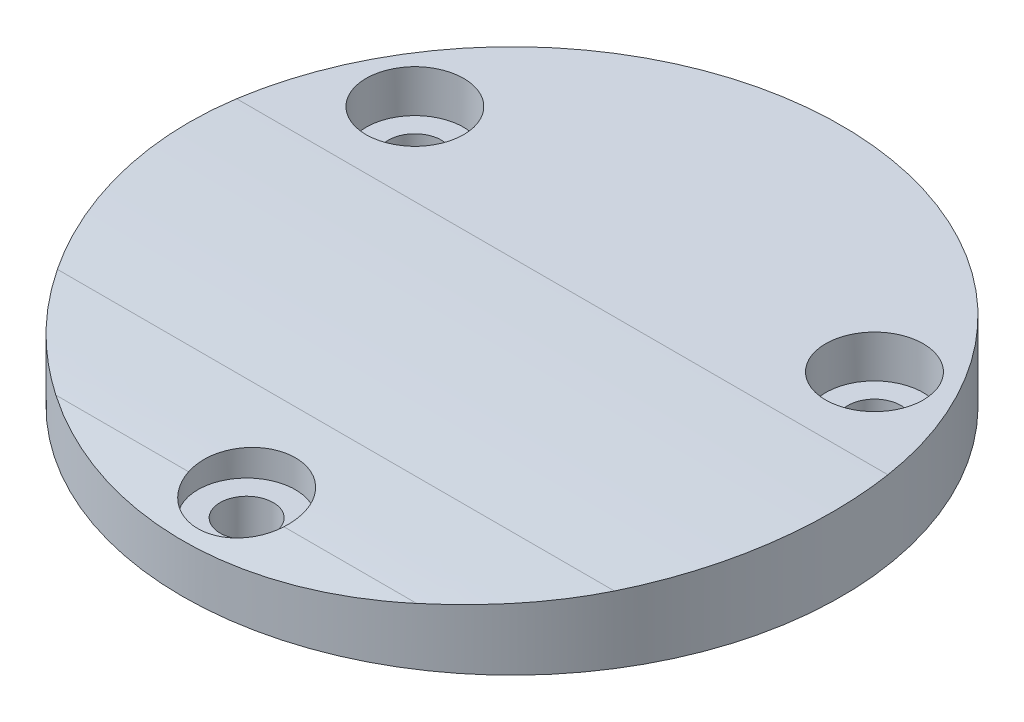
ISO-10303-21;
HEADER;
FILE_DESCRIPTION(('STEP AP214'),'2;1');
FILE_NAME('part.step','',(''),(''),'','','');
FILE_SCHEMA(('AUTOMOTIVE_DESIGN { 1 0 10303 214 1 1 1 1 }'));
ENDSEC;
DATA;
#1=APPLICATION_CONTEXT('core data for automotive mechanical design processes');
#2=APPLICATION_PROTOCOL_DEFINITION('international standard','automotive_design',2000,#1);
#3=PRODUCT_CONTEXT('',#1,'mechanical');
#4=PRODUCT('Part','Part','',(#3));
#5=PRODUCT_RELATED_PRODUCT_CATEGORY('part','',(#4));
#6=PRODUCT_DEFINITION_FORMATION('','',#4);
#7=PRODUCT_DEFINITION_CONTEXT('part definition',#1,'design');
#8=PRODUCT_DEFINITION('design','',#6,#7);
#9=PRODUCT_DEFINITION_SHAPE('','',#8);
#10=(LENGTH_UNIT() NAMED_UNIT(*) SI_UNIT(.MILLI.,.METRE.));
#11=(NAMED_UNIT(*) PLANE_ANGLE_UNIT() SI_UNIT($,.RADIAN.));
#12=(NAMED_UNIT(*) SI_UNIT($,.STERADIAN.) SOLID_ANGLE_UNIT());
#13=UNCERTAINTY_MEASURE_WITH_UNIT(LENGTH_MEASURE(1.E-05),#10,'distance_accuracy_value','');
#14=(GEOMETRIC_REPRESENTATION_CONTEXT(3) GLOBAL_UNCERTAINTY_ASSIGNED_CONTEXT((#13)) GLOBAL_UNIT_ASSIGNED_CONTEXT((#10,
#11,#12)) REPRESENTATION_CONTEXT('',''));
#15=CARTESIAN_POINT('',(0.,0.,0.));
#16=DIRECTION('',(0.,0.,1.));
#17=DIRECTION('',(1.,0.,0.));
#18=AXIS2_PLACEMENT_3D('',#15,#16,#17);
#19=CARTESIAN_POINT('',(0.,4.6,0.));
#20=DIRECTION('',(0.,-1.,0.));
#21=DIRECTION('',(0.,0.,-1.));
#22=AXIS2_PLACEMENT_3D('',#19,#20,#21);
#23=CYLINDRICAL_SURFACE('',#22,19.25);
#24=CARTESIAN_POINT('',(0.,0.,0.));
#25=DIRECTION('',(0.,1.,0.));
#26=DIRECTION('',(0.,0.,1.));
#27=AXIS2_PLACEMENT_3D('',#24,#25,#26);
#28=CIRCLE('',#27,19.25);
#29=CARTESIAN_POINT('',(0.,0.,19.25));
#30=VERTEX_POINT('',#29);
#31=EDGE_CURVE('E217',#30,#30,#28,.T.);
#32=ORIENTED_EDGE('',*,*,#31,.T.);
#33=EDGE_LOOP('',(#32));
#34=FACE_BOUND('',#33,.T.);
#35=CARTESIAN_POINT('',(16.2710640537063,3.92986396600102,10.2866405867117));
#36=CARTESIAN_POINT('',(16.4244363277219,3.95282504786389,10.0440397420118));
#37=CARTESIAN_POINT('',(16.5723733923435,3.97550668368104,9.79802482803155));
#38=CARTESIAN_POINT('',(16.8571297954413,4.02017649321473,9.29957493265114));
#39=CARTESIAN_POINT('',(16.9939489100859,4.04216465296444,9.04713982213096));
#40=CARTESIAN_POINT('',(17.387846106398,4.10696739582451,8.27986368014438));
#41=CARTESIAN_POINT('',(17.627781123529,4.14853224232021,7.75597384091091));
#42=CARTESIAN_POINT('',(18.0460120974317,4.22478164997452,6.7226934382618));
#43=CARTESIAN_POINT('',(18.2272643734911,4.25973600585415,6.21451093861963));
#44=CARTESIAN_POINT('',(18.5466226533422,4.32504635819439,5.1842272782583));
#45=CARTESIAN_POINT('',(18.6847117736944,4.35540055289811,4.66212075755178));
#46=CARTESIAN_POINT('',(18.9165877747893,4.41084583225414,3.60784128971216));
#47=CARTESIAN_POINT('',(19.0103717839558,4.43593657570434,3.07566769241928));
#48=CARTESIAN_POINT('',(19.1528761378101,4.48025265490506,2.00532709312853));
#49=CARTESIAN_POINT('',(19.2016128847678,4.49948012383683,1.46716234487481));
#50=CARTESIAN_POINT('',(19.2587790410994,4.53478274823821,0.28196661775027));
#51=CARTESIAN_POINT('',(19.2573761228469,4.54949063462846,-0.365624752666138));
#52=CARTESIAN_POINT('',(19.2064639436203,4.56426375201119,-1.33364193717558));
#53=CARTESIAN_POINT('',(19.1813988664035,4.56797327629514,-1.65549155211703));
#54=CARTESIAN_POINT('',(19.1151149576502,4.57293154526526,-2.29761215300605));
#55=CARTESIAN_POINT('',(19.0738926495442,4.57417975999989,-2.61788278417404));
#56=CARTESIAN_POINT('',(19.0246330415609,4.57417562100945,-2.93697763592934));
#57=B_SPLINE_CURVE_WITH_KNOTS('',3,(#35,#36,#37,#38,#39,#40,#41,#42,#43,#44,#45,#46,#47,#48,#49,
#50,#51,#52,#53,#54,#55,#56),.UNSPECIFIED.,.F.,.F.,(4,2,2,2,2,2,2,2,2,2,4),(0.,
0.863645468499833,1.72730831999421,3.45790531532306,5.07806855788736,6.69886474296419,
8.31976596336455,9.94007676065775,11.8795985245898,12.8477813658153,13.8161726464872),.UNSPECIFIED.);
#58=CARTESIAN_POINT('',(16.2710640537063,3.92986396600106,10.2866405867118));
#59=VERTEX_POINT('',#58);
#60=CARTESIAN_POINT('',(19.024633041561,4.57417562100951,-2.93697763592846));
#61=VERTEX_POINT('',#60);
#62=EDGE_CURVE('E48',#59,#61,#57,.T.);
#63=ORIENTED_EDGE('',*,*,#62,.F.);
#64=CARTESIAN_POINT('',(10.5404189855535,3.34516455246532,16.1078262844179));
#65=CARTESIAN_POINT('',(10.7624279011341,3.3681125602584,15.96255653518));
#66=CARTESIAN_POINT('',(10.9815033498053,3.39000522164486,15.8126407339489));
#67=CARTESIAN_POINT('',(11.4133861394352,3.4320201407602,15.5037914504919));
#68=CARTESIAN_POINT('',(11.6261933279733,3.45214235546206,15.3448577492591));
#69=CARTESIAN_POINT('',(12.0450285541638,3.49094641230307,15.0183313884092));
#70=CARTESIAN_POINT('',(12.2510597496091,3.5096289309914,14.8507428585181));
#71=CARTESIAN_POINT('',(12.6560557289664,3.54599494081606,14.5071453240048));
#72=CARTESIAN_POINT('',(12.855020823866,3.56367847593914,14.3311366907636));
#73=CARTESIAN_POINT('',(13.2035185230568,3.59477113209275,14.0097487814679));
#74=CARTESIAN_POINT('',(13.3544787542411,3.60828153606433,13.8659241797283));
#75=CARTESIAN_POINT('',(13.6516423034912,3.63523721872747,13.5734530984603));
#76=CARTESIAN_POINT('',(13.7978457614311,3.64868249932408,13.4248067609733));
#77=CARTESIAN_POINT('',(14.2290606565249,3.68922372688467,12.9718958060975));
#78=CARTESIAN_POINT('',(14.5067375570599,3.7165303125639,12.6606030375562));
#79=CARTESIAN_POINT('',(15.0458293792566,3.77316734602319,12.0152118071888));
#80=CARTESIAN_POINT('',(15.3068801726612,3.80252462109778,11.6808121179139));
#81=CARTESIAN_POINT('',(15.8062897447078,3.86391667806714,10.9956218562162));
#82=CARTESIAN_POINT('',(16.0446445147693,3.89595193107801,10.6448284045714));
#83=CARTESIAN_POINT('',(16.2710640537063,3.92986396600103,10.2866405867119));
#84=B_SPLINE_CURVE_WITH_KNOTS('',3,(#64,#65,#66,#67,#68,#69,#70,#71,#72,#73,#74,#75,#76,#77,#78,
#79,#80,#81,#82,#83),.UNSPECIFIED.,.F.,.F.,(4,2,2,2,2,2,2,2,2,4),(0.,0.798851038365209,
1.59772148578086,2.39621420525488,3.19467173844601,3.821390267739,4.44809035155057,
5.701241774886,6.97605770416191,8.25109837589357),.UNSPECIFIED.);
#85=CARTESIAN_POINT('',(10.5404189855535,3.34516455246532,16.1078262844179));
#86=VERTEX_POINT('',#85);
#87=EDGE_CURVE('E96',#86,#59,#84,.T.);
#88=ORIENTED_EDGE('',*,*,#87,.F.);
#89=CARTESIAN_POINT('',(-10.5404189855384,3.34516455246377,16.1078262844278));
#90=CARTESIAN_POINT('',(-10.2418668509237,3.31431987830252,16.3032017043631));
#91=CARTESIAN_POINT('',(-9.93779630406692,3.28449367544795,16.4903077605862));
#92=CARTESIAN_POINT('',(-9.31955867862745,3.22711650176303,16.8474228020255));
#93=CARTESIAN_POINT('',(-9.00539136059516,3.19956558494752,17.0174313813718));
#94=CARTESIAN_POINT('',(-8.3679136580749,3.14697866971792,17.3397843488005));
#95=CARTESIAN_POINT('',(-8.04460324236648,3.12194267989274,17.4921286765565));
#96=CARTESIAN_POINT('',(-7.3899899761028,3.07460335919621,17.7785862610687));
#97=CARTESIAN_POINT('',(-7.05869090946973,3.05229876385811,17.9127079569491));
#98=CARTESIAN_POINT('',(-6.38898336667049,3.01059130468792,18.1623534645324));
#99=CARTESIAN_POINT('',(-6.05057509850037,2.99118835609595,18.277877819489));
#100=CARTESIAN_POINT('',(-5.36772892211455,2.955439388919,18.4899387228625));
#101=CARTESIAN_POINT('',(-5.02329109082086,2.93909333136684,18.5864755133209));
#102=CARTESIAN_POINT('',(-4.15561723443782,2.90219751042554,18.8037589134118));
#103=CARTESIAN_POINT('',(-3.6292165402604,2.8836415644829,18.9124216971169));
#104=CARTESIAN_POINT('',(-2.56893450332511,2.85403854548601,19.0853798665317));
#105=CARTESIAN_POINT('',(-2.0350520638838,2.84299258525702,19.1496686769537));
#106=CARTESIAN_POINT('',(-0.96378074143886,2.82860288099789,19.2333614513645));
#107=CARTESIAN_POINT('',(-0.426392638366891,2.82525747868434,19.2527750790428));
#108=CARTESIAN_POINT('',(0.648101026205975,2.82632295366315,19.2465865441251));
#109=CARTESIAN_POINT('',(1.18520659649489,2.83073357345176,19.2209858760258));
#110=CARTESIAN_POINT('',(2.25205231516323,2.8471835015006,19.1252689737798));
#111=CARTESIAN_POINT('',(2.78181731161236,2.85917695075978,19.0554203350412));
#112=CARTESIAN_POINT('',(3.83355182945607,2.8905494854521,18.8719693870533));
#113=CARTESIAN_POINT('',(4.35552151797103,2.90992841231416,18.7583680172034));
#114=CARTESIAN_POINT('',(5.1295954181286,2.94426818801885,18.5558866139222));
#115=CARTESIAN_POINT('',(5.38611601656894,2.95659192418953,18.4830546905243));
#116=CARTESIAN_POINT('',(5.89576847264977,2.9829387786792,18.3268499871234));
#117=CARTESIAN_POINT('',(6.14890115996745,2.99696147215422,18.2434798421));
#118=CARTESIAN_POINT('',(6.90251345237087,3.04148498776163,17.9778030018434));
#119=CARTESIAN_POINT('',(7.39744245119409,3.07445174882273,17.7798683326362));
#120=CARTESIAN_POINT('',(8.34499610312496,3.14459967146318,17.354535110865));
#121=CARTESIAN_POINT('',(8.79850599069466,3.1814959563835,17.1290503963132));
#122=CARTESIAN_POINT('',(9.68512999678222,3.25997108979283,16.6437966900542));
#123=CARTESIAN_POINT('',(10.1182849331959,3.30153994564959,16.3841006644896));
#124=CARTESIAN_POINT('',(10.5404189855384,3.34516455246377,16.1078262844278));
#125=B_SPLINE_CURVE_WITH_KNOTS('',3,(#89,#90,#91,#92,#93,#94,#95,#96,#97,#98,#99,#100,#101,#102,
#103,#104,#105,#106,#107,#108,#109,#110,#111,#112,#113,#114,#115,#116,#117,#118,#119,#120,#121,
#122,#123,#124),.UNSPECIFIED.,.F.,.F.,(4,2,2,2,2,2,2,2,2,2,2,2,2,2,2,2,2,4),(0.,
1.07425010820436,2.14852571156947,3.22280498364929,4.29658503555032,5.37033371517904,
6.44406870645301,8.05548002625197,9.66713007202045,11.2784330231128,12.8896824791674,
14.4912795224164,16.092842180255,16.8934715201213,17.6939010649535,19.2940325159469,
20.8159257081059,22.3346240143036),.UNSPECIFIED.);
#126=CARTESIAN_POINT('',(-10.5404189855535,3.34516455246532,16.1078262844179));
#127=VERTEX_POINT('',#126);
#128=EDGE_CURVE('E95',#127,#86,#125,.T.);
#129=ORIENTED_EDGE('',*,*,#128,.F.);
#130=CARTESIAN_POINT('',(-16.2710640537063,3.92986396600103,10.2866405867119));
#131=CARTESIAN_POINT('',(-16.1287038730529,3.90855066574387,10.5118183130393));
#132=CARTESIAN_POINT('',(-15.9816642064606,3.88797528611721,10.734051854433));
#133=CARTESIAN_POINT('',(-15.6784284227248,3.84803456053049,11.1723064626119));
#134=CARTESIAN_POINT('',(-15.5222319508967,3.82866926150242,11.3883272882667));
#135=CARTESIAN_POINT('',(-15.0404554259536,3.77201883377982,12.0262578182621));
#136=CARTESIAN_POINT('',(-14.7014863623806,3.73614978702183,12.4383549206726));
#137=CARTESIAN_POINT('',(-14.2073981474123,3.68743617011513,12.9906000778678));
#138=CARTESIAN_POINT('',(-14.0661865140074,3.67388682335608,13.1433704984722));
#139=CARTESIAN_POINT('',(-13.7788785809586,3.64692558685492,13.4442647829562));
#140=CARTESIAN_POINT('',(-13.6327824223837,3.63351369315763,13.5923887807891));
#141=CARTESIAN_POINT('',(-13.1874452575308,3.59315933034181,14.0294975586485));
#142=CARTESIAN_POINT('',(-12.8810973855135,3.56609261760341,14.3112841387484));
#143=CARTESIAN_POINT('',(-12.245468795588,3.50920369001676,14.8590042192875));
#144=CARTESIAN_POINT('',(-11.9158838897492,3.47934203303782,15.1245809135204));
#145=CARTESIAN_POINT('',(-11.4091279825196,3.43153240182358,15.5060971581998));
#146=CARTESIAN_POINT('',(-11.2381169013972,3.41509002671603,15.6304803146558));
#147=CARTESIAN_POINT('',(-10.8921671167535,3.38104066896353,15.8734960895375));
#148=CARTESIAN_POINT('',(-10.7172283700576,3.36343367351246,15.9921286447049));
#149=CARTESIAN_POINT('',(-10.5404189855535,3.34516455246532,16.1078262844179));
#150=B_SPLINE_CURVE_WITH_KNOTS('',3,(#130,#131,#132,#133,#134,#135,#136,#137,#138,#139,#140,
#141,#142,#143,#144,#145,#146,#147,#148,#149),.UNSPECIFIED.,.F.,.F.,(4,2,2,2,2,2,2,2,2,4),(0.,
0.801616213947827,1.60326349865974,3.20542454973594,3.83078673492679,4.45613087472348,
5.70655739903306,6.97852891149921,7.61472547494545,8.25092903514256),.UNSPECIFIED.);
#151=CARTESIAN_POINT('',(-16.2710640537063,3.92986396600103,10.2866405867119));
#152=VERTEX_POINT('',#151);
#153=EDGE_CURVE('E85',#152,#127,#150,.T.);
#154=ORIENTED_EDGE('',*,*,#153,.F.);
#155=CARTESIAN_POINT('',(-19.0246330415609,4.57417562100945,-2.93697763592934));
#156=CARTESIAN_POINT('',(-19.0685786761404,4.57417780708839,-2.65231146553786));
#157=CARTESIAN_POINT('',(-19.106128171566,4.57318528113114,-2.36670112745905));
#158=CARTESIAN_POINT('',(-19.1683775051726,4.56923696860709,-1.79409389296219));
#159=CARTESIAN_POINT('',(-19.1930772024129,4.56628116050715,-1.50709698137059));
#160=CARTESIAN_POINT('',(-19.2478693562418,4.55449624828704,-0.643920981682732));
#161=CARTESIAN_POINT('',(-19.2585218363177,4.54274979882136,-0.066418814819457));
#162=CARTESIAN_POINT('',(-19.229005668565,4.51299733128686,1.04712413097155));
#163=CARTESIAN_POINT('',(-19.192289653422,4.49547862001439,1.58327881856267));
#164=CARTESIAN_POINT('',(-19.0741942787888,4.45450751617892,2.65065640363769));
#165=CARTESIAN_POINT('',(-18.9927974201039,4.4310528007285,3.18187728585523));
#166=CARTESIAN_POINT('',(-18.785915785846,4.37876529251227,4.23559051144806));
#167=CARTESIAN_POINT('',(-18.6604156523973,4.34993062795491,4.75807974776435));
#168=CARTESIAN_POINT('',(-18.3663673049555,4.2875165122258,5.79025394887725));
#169=CARTESIAN_POINT('',(-18.197834062877,4.25393871307891,6.29994329935825));
#170=CARTESIAN_POINT('',(-17.7782370457375,4.17514321810816,7.41083221686624));
#171=CARTESIAN_POINT('',(-17.5172288247075,4.12897259260507,8.00826029746443));
#172=CARTESIAN_POINT('',(-17.0819615395328,4.05644504179837,8.88114281537822));
#173=CARTESIAN_POINT('',(-16.9297530887672,4.03175011650366,9.16795319217121));
#174=CARTESIAN_POINT('',(-16.6110387817649,3.98144477019787,9.73350920297231));
#175=CARTESIAN_POINT('',(-16.4445301242399,3.95583417039012,10.0122532424905));
#176=CARTESIAN_POINT('',(-16.2710640537063,3.92986396600102,10.2866405867117));
#177=B_SPLINE_CURVE_WITH_KNOTS('',3,(#155,#156,#157,#158,#159,#160,#161,#162,#163,#164,#165,
#166,#167,#168,#169,#170,#171,#172,#173,#174,#175,#176),.UNSPECIFIED.,.F.,.F.,(4,2,2,2,2,2,2,2,
2,2,4),(0.,0.86395531731424,1.72792011057657,3.45845717461314,5.06970320125997,6.68158072103978,
8.29402009444043,9.90589923667723,11.8628851434336,12.8394366019291,13.8161797967674),.UNSPECIFIED.);
#178=CARTESIAN_POINT('',(-19.024633041561,4.57417562100951,-2.93697763592846));
#179=VERTEX_POINT('',#178);
#180=EDGE_CURVE('E11',#179,#152,#177,.T.);
#181=ORIENTED_EDGE('',*,*,#180,.F.);
#182=CARTESIAN_POINT('',(0.,4.57417562100951,0.));
#183=DIRECTION('',(0.,-1.,0.));
#184=DIRECTION('',(0.,0.,-1.));
#185=AXIS2_PLACEMENT_3D('',#182,#183,#184);
#186=CIRCLE('',#185,19.25);
#187=EDGE_CURVE('E81',#179,#61,#186,.T.);
#188=ORIENTED_EDGE('',*,*,#187,.T.);
#189=EDGE_LOOP('',(#63,#88,#129,#154,#181,#188));
#190=FACE_BOUND('',#189,.T.);
#191=ADVANCED_FACE('F34',(#34,#190),#23,.T.);
#192=CARTESIAN_POINT('',(0.,2.1,15.5));
#193=DIRECTION('',(0.,1.,0.));
#194=DIRECTION('',(0.,0.,1.));
#195=AXIS2_PLACEMENT_3D('',#192,#193,#194);
#196=CYLINDRICAL_SURFACE('',#195,2.85);
#197=CARTESIAN_POINT('',(0.,2.1,15.5));
#198=DIRECTION('',(0.,1.,0.));
#199=DIRECTION('',(0.,0.,1.));
#200=AXIS2_PLACEMENT_3D('',#197,#198,#199);
#201=CIRCLE('',#200,2.85);
#202=CARTESIAN_POINT('',(0.,2.1,18.35));
#203=VERTEX_POINT('',#202);
#204=EDGE_CURVE('E233',#203,#203,#201,.T.);
#205=ORIENTED_EDGE('',*,*,#204,.F.);
#206=EDGE_LOOP('',(#205));
#207=FACE_BOUND('',#206,.T.);
#208=CARTESIAN_POINT('',(2.78442942233391,3.34516455246377,16.1078262844278));
#209=CARTESIAN_POINT('',(2.76724099312184,3.33273005205477,16.1865989575251));
#210=CARTESIAN_POINT('',(2.74669454363597,3.3203616967115,16.2646460639332));
#211=CARTESIAN_POINT('',(2.69905359887449,3.2958517850886,16.4187514436356));
#212=CARTESIAN_POINT('',(2.67195915119773,3.28371022716103,16.4948097313825));
#213=CARTESIAN_POINT('',(2.61139685616414,3.25975096793653,16.6443838784114));
#214=CARTESIAN_POINT('',(2.57793046360992,3.24793319341854,16.7179003135149));
#215=CARTESIAN_POINT('',(2.50486651312834,3.22471709154736,16.8618622516972));
#216=CARTESIAN_POINT('',(2.46526908448987,3.21331875535548,16.9323078194929));
#217=CARTESIAN_POINT('',(2.33758609251491,3.17987758987996,17.1383688995795));
#218=CARTESIAN_POINT('',(2.24059656020306,3.1585833541022,17.2687414993145));
#219=CARTESIAN_POINT('',(2.0257325434451,3.118779561595,17.5112632570681));
#220=CARTESIAN_POINT('',(1.90786521903479,3.10026905419766,17.623418637481));
#221=CARTESIAN_POINT('',(1.65544983110628,3.0667928817283,17.8254899573002));
#222=CARTESIAN_POINT('',(1.52103814869747,3.05180085134325,17.9155715448141));
#223=CARTESIAN_POINT('',(1.23860759745911,3.02572272333564,18.071848164451));
#224=CARTESIAN_POINT('',(1.09058728826418,3.01463703977045,18.1380406644428));
#225=CARTESIAN_POINT('',(0.787260403361547,2.99690477765723,18.243752028995));
#226=CARTESIAN_POINT('',(0.632075875044184,2.99020150574627,18.2836116249685));
#227=CARTESIAN_POINT('',(0.317116437029494,2.98125196226926,18.3368006335818));
#228=CARTESIAN_POINT('',(0.157342216163058,2.97900502539577,18.3501340064485));
#229=CARTESIAN_POINT('',(-0.160706572367822,2.97905029003782,18.3498651859351));
#230=CARTESIAN_POINT('',(-0.318981416323303,2.98130093031872,18.3365096198518));
#231=CARTESIAN_POINT('',(-0.631016550140113,2.99017544138759,18.2837665178236));
#232=CARTESIAN_POINT('',(-0.784776504940553,2.99679963589519,18.244377054914));
#233=CARTESIAN_POINT('',(-1.08338807741594,3.014177132415,18.1407841398562));
#234=CARTESIAN_POINT('',(-1.22824237784806,3.02492918380244,18.0765882033349));
#235=CARTESIAN_POINT('',(-1.50506901972277,3.05017770971219,17.9253123160106));
#236=CARTESIAN_POINT('',(-1.63704339574046,3.0646735915175,17.838235987555));
#237=CARTESIAN_POINT('',(-1.8856162142471,3.09704286792592,17.6429325305862));
#238=CARTESIAN_POINT('',(-2.00207500090291,3.11494382188357,17.5345325534414));
#239=CARTESIAN_POINT('',(-2.21526424375829,3.15345743476559,17.3000534310716));
#240=CARTESIAN_POINT('',(-2.31198571980872,3.17407132104409,17.1739662823053));
#241=CARTESIAN_POINT('',(-2.4432890656649,3.20725881802444,16.9697092348925));
#242=CARTESIAN_POINT('',(-2.48588204590469,3.21912586463619,16.896446586677));
#243=CARTESIAN_POINT('',(-2.56437033049075,3.24333672656003,16.7464591878529));
#244=CARTESIAN_POINT('',(-2.60026499921776,3.25568058698416,16.6697341095429));
#245=CARTESIAN_POINT('',(-2.66509185936645,3.28074178639905,16.5133868574655));
#246=CARTESIAN_POINT('',(-2.6940183171884,3.29345942335393,16.4337623595779));
#247=CARTESIAN_POINT('',(-2.744671847816,3.31914865220562,16.272300150341));
#248=CARTESIAN_POINT('',(-2.76639931042402,3.33212023031204,16.1904625590832));
#249=CARTESIAN_POINT('',(-2.78442942233391,3.34516455246377,16.1078262844278));
#250=B_SPLINE_CURVE_WITH_KNOTS('',3,(#208,#209,#210,#211,#212,#213,#214,#215,#216,#217,#218,
#219,#220,#221,#222,#223,#224,#225,#226,#227,#228,#229,#230,#231,#232,#233,#234,#235,#236,#237,
#238,#239,#240,#241,#242,#243,#244,#245,#246,#247,#248,#249),.UNSPECIFIED.,.F.,.F.,(4,2,2,2,2,2,
2,2,2,2,2,2,2,2,2,2,2,2,2,2,4),(0.,0.244660621103023,0.489319463767126,0.733922514292019,
0.978520407425626,1.46761048751874,1.95653315785565,2.44166599131138,2.92685023147873,
3.40562667595555,3.88433163623744,4.35863343234335,4.83297033902883,5.30716364821331,
5.78128192987557,6.25941474734521,6.73776462465284,6.99419619532444,7.25065208705878,
7.50731828112646,7.7639705752759),.UNSPECIFIED.);
#251=CARTESIAN_POINT('',(2.78442942233606,3.34516455246532,16.1078262844179));
#252=VERTEX_POINT('',#251);
#253=CARTESIAN_POINT('',(-2.78442942233606,3.34516455246532,16.1078262844179));
#254=VERTEX_POINT('',#253);
#255=EDGE_CURVE('E157',#252,#254,#250,.T.);
#256=ORIENTED_EDGE('',*,*,#255,.F.);
#257=CARTESIAN_POINT('',(-2.78442942233606,3.34516455246532,16.1078262844179));
#258=CARTESIAN_POINT('',(-2.80151655138763,3.3575180982703,16.0295899361655));
#259=CARTESIAN_POINT('',(-2.81530224665428,3.36947856219574,15.9505731791776));
#260=CARTESIAN_POINT('',(-2.83618004161155,3.39263502224889,15.7915507631419));
#261=CARTESIAN_POINT('',(-2.84327223510986,3.40383102908822,15.7115451179691));
#262=CARTESIAN_POINT('',(-2.85067077459099,3.4254747418794,15.5511581449731));
#263=CARTESIAN_POINT('',(-2.85098080083806,3.4359228506012,15.4707770445743));
#264=CARTESIAN_POINT('',(-2.84481006734373,3.45611070839239,15.3102106601065));
#265=CARTESIAN_POINT('',(-2.83832946438198,3.46585047381021,15.2300253715597));
#266=CARTESIAN_POINT('',(-2.80869353541471,3.49408220575628,14.9905238913647));
#267=CARTESIAN_POINT('',(-2.77534579439308,3.51159152745341,14.8322248305846));
#268=CARTESIAN_POINT('',(-2.68232519334019,3.54426728815372,14.5234432775863));
#269=CARTESIAN_POINT('',(-2.62265948426845,3.55943436206799,14.3729586744769));
#270=CARTESIAN_POINT('',(-2.47894678695777,3.58763633716746,14.0846774558127));
#271=CARTESIAN_POINT('',(-2.39500371627321,3.60067996328239,13.9468299924384));
#272=CARTESIAN_POINT('',(-2.20497159662355,3.62482886597644,13.6871297340297));
#273=CARTESIAN_POINT('',(-2.09887903829535,3.6359338348823,13.5652794785809));
#274=CARTESIAN_POINT('',(-1.86798660435092,3.6561524097286,13.3415582561523));
#275=CARTESIAN_POINT('',(-1.7432569207388,3.66527318490554,13.2396155013868));
#276=CARTESIAN_POINT('',(-1.47834413228586,3.68143782779647,13.0581205060797));
#277=CARTESIAN_POINT('',(-1.33816243020533,3.68848188382553,12.9785662353997));
#278=CARTESIAN_POINT('',(-1.04682873660139,3.70033855542915,12.8443865919031));
#279=CARTESIAN_POINT('',(-0.89571563058648,3.7051586702497,12.7896774499776));
#280=CARTESIAN_POINT('',(-0.58639652685721,3.71249203540719,12.7063836375026));
#281=CARTESIAN_POINT('',(-0.42819049726038,3.71500527537372,12.6777990843948));
#282=CARTESIAN_POINT('',(-0.109641185739647,3.71765761238401,12.6476315691756));
#283=CARTESIAN_POINT('',(0.0506951038979084,3.71780315518521,12.6459752982136));
#284=CARTESIAN_POINT('',(0.369365966435343,3.71573289978974,12.6695239587836));
#285=CARTESIAN_POINT('',(0.527700559375546,3.71351712525276,12.6947286211769));
#286=CARTESIAN_POINT('',(0.837753680451171,3.70678292648817,12.7712371602138));
#287=CARTESIAN_POINT('',(0.989477098413947,3.70226623658331,12.8225213792522));
#288=CARTESIAN_POINT('',(1.28214564633675,3.69103620980966,12.9496941851068));
#289=CARTESIAN_POINT('',(1.42309079801653,3.68432287736756,13.0255827223402));
#290=CARTESIAN_POINT('',(1.6904502727287,3.66881728558601,13.1999160404935));
#291=CARTESIAN_POINT('',(1.81684144774955,3.66002178063891,13.2983960285719));
#292=CARTESIAN_POINT('',(2.05129728618262,3.64049722078452,13.5150179236944));
#293=CARTESIAN_POINT('',(2.15936150834119,3.62976811933532,13.6331603040095));
#294=CARTESIAN_POINT('',(2.35445534268267,3.60637542965668,13.886113093531));
#295=CARTESIAN_POINT('',(2.44141897519537,3.59370597053084,14.0209738428649));
#296=CARTESIAN_POINT('',(2.59147267762116,3.56635787337602,14.3032082241312));
#297=CARTESIAN_POINT('',(2.65456086046676,3.55167907665786,14.4505828440081));
#298=CARTESIAN_POINT('',(2.7553336959454,3.52003370135314,14.7541340822583));
#299=CARTESIAN_POINT('',(2.79292404337417,3.5030589053933,14.910341085991));
#300=CARTESIAN_POINT('',(2.84134513154327,3.46654158696073,15.226518769601));
#301=CARTESIAN_POINT('',(2.85219215578043,3.44700063461026,15.3864870993413));
#302=CARTESIAN_POINT('',(2.84810847994481,3.41358170462482,15.6406019779464));
#303=CARTESIAN_POINT('',(2.84185841609312,3.40062733232162,15.7350928252864));
#304=CARTESIAN_POINT('',(2.82006164330894,3.37368594884072,15.9226770860726));
#305=CARTESIAN_POINT('',(2.80453115245811,3.35970077633506,16.01577264761));
#306=CARTESIAN_POINT('',(2.78442942233607,3.34516455246532,16.1078262844179));
#307=B_SPLINE_CURVE_WITH_KNOTS('',3,(#257,#258,#259,#260,#261,#262,#263,#264,#265,#266,#267,
#268,#269,#270,#271,#272,#273,#274,#275,#276,#277,#278,#279,#280,#281,#282,#283,#284,#285,#286,
#287,#288,#289,#290,#291,#292,#293,#294,#295,#296,#297,#298,#299,#300,#301,#302,#303,#304,#305,
#306),.UNSPECIFIED.,.F.,.F.,(4,2,2,2,2,2,2,2,2,2,2,2,2,2,2,2,2,2,2,2,2,2,2,2,4),(0.,
0.243007257037351,0.486011108340338,0.728883093154526,0.97174947074961,1.45737080275327,
1.9428602658619,2.42630162665226,2.90981964206262,3.39156048643164,3.87325763351626,
4.35331838294277,4.8333812904434,5.31213706774139,5.79088804809363,6.26927870103361,
6.74766838992205,7.22680874150287,7.70596062759365,8.18659200934217,8.6672613712976,
9.14969896189384,9.63184273286541,9.91815486001423,10.2039680974839),.UNSPECIFIED.);
#308=EDGE_CURVE('E154',#254,#252,#307,.T.);
#309=ORIENTED_EDGE('',*,*,#308,.F.);
#310=EDGE_LOOP('',(#256,#309));
#311=FACE_BOUND('',#310,.T.);
#312=ADVANCED_FACE('F177',(#207,#311),#196,.F.);
#313=CARTESIAN_POINT('',(13.4233937586588,4.6,-7.75000000000007));
#314=DIRECTION('',(0.,-1.,0.));
#315=DIRECTION('',(0.,0.,-1.));
#316=AXIS2_PLACEMENT_3D('',#313,#314,#315);
#317=CYLINDRICAL_SURFACE('',#316,1.55);
#318=CARTESIAN_POINT('',(13.4233937586588,0.,-7.75000000000007));
#319=DIRECTION('',(0.,1.,0.));
#320=DIRECTION('',(0.,0.,1.));
#321=AXIS2_PLACEMENT_3D('',#318,#319,#320);
#322=CIRCLE('',#321,1.55);
#323=CARTESIAN_POINT('',(13.4233937586588,0.,-6.20000000000007));
#324=VERTEX_POINT('',#323);
#325=EDGE_CURVE('E221',#324,#324,#322,.T.);
#326=ORIENTED_EDGE('',*,*,#325,.F.);
#327=EDGE_LOOP('',(#326));
#328=FACE_BOUND('',#327,.T.);
#329=CARTESIAN_POINT('',(13.4233937586588,2.1,-7.75000000000007));
#330=DIRECTION('',(0.,1.,0.));
#331=DIRECTION('',(0.,0.,1.));
#332=AXIS2_PLACEMENT_3D('',#329,#330,#331);
#333=CIRCLE('',#332,1.55);
#334=CARTESIAN_POINT('',(13.4233937586588,2.1,-6.20000000000007));
#335=VERTEX_POINT('',#334);
#336=EDGE_CURVE('E234',#335,#335,#333,.T.);
#337=ORIENTED_EDGE('',*,*,#336,.T.);
#338=EDGE_LOOP('',(#337));
#339=FACE_BOUND('',#338,.T.);
#340=ADVANCED_FACE('F182',(#328,#339),#317,.F.);
#341=CARTESIAN_POINT('',(0.,4.6,15.5));
#342=DIRECTION('',(0.,-1.,0.));
#343=DIRECTION('',(0.,0.,-1.));
#344=AXIS2_PLACEMENT_3D('',#341,#342,#343);
#345=CYLINDRICAL_SURFACE('',#344,1.55);
#346=CARTESIAN_POINT('',(0.,0.,15.5));
#347=DIRECTION('',(0.,1.,0.));
#348=DIRECTION('',(0.,0.,1.));
#349=AXIS2_PLACEMENT_3D('',#346,#347,#348);
#350=CIRCLE('',#349,1.55);
#351=CARTESIAN_POINT('',(0.,0.,17.05));
#352=VERTEX_POINT('',#351);
#353=EDGE_CURVE('E218',#352,#352,#350,.T.);
#354=ORIENTED_EDGE('',*,*,#353,.F.);
#355=EDGE_LOOP('',(#354));
#356=FACE_BOUND('',#355,.T.);
#357=CARTESIAN_POINT('',(0.,2.1,15.5));
#358=DIRECTION('',(0.,1.,0.));
#359=DIRECTION('',(0.,0.,1.));
#360=AXIS2_PLACEMENT_3D('',#357,#358,#359);
#361=CIRCLE('',#360,1.55);
#362=CARTESIAN_POINT('',(0.,2.1,17.05));
#363=VERTEX_POINT('',#362);
#364=EDGE_CURVE('E230',#363,#363,#361,.T.);
#365=ORIENTED_EDGE('',*,*,#364,.T.);
#366=EDGE_LOOP('',(#365));
#367=FACE_BOUND('',#366,.T.);
#368=ADVANCED_FACE('F199',(#356,#367),#345,.F.);
#369=CARTESIAN_POINT('',(-13.4233937586588,4.6,-7.75000000000006));
#370=DIRECTION('',(0.,-1.,0.));
#371=DIRECTION('',(0.,0.,-1.));
#372=AXIS2_PLACEMENT_3D('',#369,#370,#371);
#373=CYLINDRICAL_SURFACE('',#372,1.55);
#374=CARTESIAN_POINT('',(-13.4233937586588,0.,-7.75000000000006));
#375=DIRECTION('',(0.,1.,0.));
#376=DIRECTION('',(0.,0.,-1.));
#377=AXIS2_PLACEMENT_3D('',#374,#375,#376);
#378=CIRCLE('',#377,1.55);
#379=CARTESIAN_POINT('',(-13.4233937586588,0.,-9.30000000000006));
#380=VERTEX_POINT('',#379);
#381=EDGE_CURVE('E228',#380,#380,#378,.T.);
#382=ORIENTED_EDGE('',*,*,#381,.F.);
#383=EDGE_LOOP('',(#382));
#384=FACE_BOUND('',#383,.T.);
#385=CARTESIAN_POINT('',(-13.4233937586588,2.1,-7.75000000000006));
#386=DIRECTION('',(0.,1.,0.));
#387=DIRECTION('',(0.,0.,1.));
#388=AXIS2_PLACEMENT_3D('',#385,#386,#387);
#389=CIRCLE('',#388,1.55);
#390=CARTESIAN_POINT('',(-13.4233937586588,2.1,-6.20000000000007));
#391=VERTEX_POINT('',#390);
#392=EDGE_CURVE('E225',#391,#391,#389,.T.);
#393=ORIENTED_EDGE('',*,*,#392,.T.);
#394=EDGE_LOOP('',(#393));
#395=FACE_BOUND('',#394,.T.);
#396=ADVANCED_FACE('F196',(#384,#395),#373,.F.);
#397=CARTESIAN_POINT('',(0.,0.,0.));
#398=DIRECTION('',(0.,1.,0.));
#399=DIRECTION('',(0.,0.,1.));
#400=AXIS2_PLACEMENT_3D('',#397,#398,#399);
#401=PLANE('',#400);
#402=ORIENTED_EDGE('',*,*,#31,.F.);
#403=EDGE_LOOP('',(#402));
#404=FACE_BOUND('',#403,.T.);
#405=ORIENTED_EDGE('',*,*,#353,.T.);
#406=EDGE_LOOP('',(#405));
#407=FACE_BOUND('',#406,.T.);
#408=ORIENTED_EDGE('',*,*,#325,.T.);
#409=EDGE_LOOP('',(#408));
#410=FACE_BOUND('',#409,.T.);
#411=ORIENTED_EDGE('',*,*,#381,.T.);
#412=EDGE_LOOP('',(#411));
#413=FACE_BOUND('',#412,.T.);
#414=ADVANCED_FACE('F194',(#404,#407,#410,#413),#401,.F.);
#415=CARTESIAN_POINT('',(-13.4233937586588,2.1,-7.75000000000006));
#416=DIRECTION('',(0.,1.,0.));
#417=DIRECTION('',(0.,0.,1.));
#418=AXIS2_PLACEMENT_3D('',#415,#416,#417);
#419=CYLINDRICAL_SURFACE('',#418,2.85);
#420=CARTESIAN_POINT('',(-13.4233937586588,4.57417562100951,-7.75000000000006));
#421=DIRECTION('',(0.,-1.,0.));
#422=DIRECTION('',(0.,0.,-1.));
#423=AXIS2_PLACEMENT_3D('',#420,#421,#422);
#424=CIRCLE('',#423,2.85);
#425=CARTESIAN_POINT('',(-13.4233937586588,4.57417562100951,-10.6000000000001));
#426=VERTEX_POINT('',#425);
#427=EDGE_CURVE('E86',#426,#426,#424,.F.);
#428=ORIENTED_EDGE('',*,*,#427,.T.);
#429=EDGE_LOOP('',(#428));
#430=FACE_BOUND('',#429,.T.);
#431=CARTESIAN_POINT('',(-13.4233937586588,2.1,-7.75000000000006));
#432=DIRECTION('',(0.,1.,0.));
#433=DIRECTION('',(0.,0.,1.));
#434=AXIS2_PLACEMENT_3D('',#431,#432,#433);
#435=CIRCLE('',#434,2.85);
#436=CARTESIAN_POINT('',(-13.4233937586588,2.1,-4.90000000000006));
#437=VERTEX_POINT('',#436);
#438=EDGE_CURVE('E229',#437,#437,#435,.T.);
#439=ORIENTED_EDGE('',*,*,#438,.F.);
#440=EDGE_LOOP('',(#439));
#441=FACE_BOUND('',#440,.T.);
#442=ADVANCED_FACE('F190',(#430,#441),#419,.F.);
#443=CARTESIAN_POINT('',(-13.4233937586588,2.1,-7.75000000000006));
#444=DIRECTION('',(0.,1.,0.));
#445=DIRECTION('',(0.,0.,1.));
#446=AXIS2_PLACEMENT_3D('',#443,#444,#445);
#447=PLANE('',#446);
#448=ORIENTED_EDGE('',*,*,#392,.F.);
#449=EDGE_LOOP('',(#448));
#450=FACE_BOUND('',#449,.T.);
#451=ORIENTED_EDGE('',*,*,#438,.T.);
#452=EDGE_LOOP('',(#451));
#453=FACE_BOUND('',#452,.T.);
#454=ADVANCED_FACE('F186',(#450,#453),#447,.T.);
#455=CARTESIAN_POINT('',(0.,2.1,15.5));
#456=DIRECTION('',(0.,1.,0.));
#457=DIRECTION('',(0.,0.,1.));
#458=AXIS2_PLACEMENT_3D('',#455,#456,#457);
#459=PLANE('',#458);
#460=ORIENTED_EDGE('',*,*,#364,.F.);
#461=EDGE_LOOP('',(#460));
#462=FACE_BOUND('',#461,.T.);
#463=ORIENTED_EDGE('',*,*,#204,.T.);
#464=EDGE_LOOP('',(#463));
#465=FACE_BOUND('',#464,.T.);
#466=ADVANCED_FACE('F184',(#462,#465),#459,.T.);
#467=CARTESIAN_POINT('',(13.4233937586588,2.1,-7.75000000000007));
#468=DIRECTION('',(0.,1.,0.));
#469=DIRECTION('',(0.,0.,1.));
#470=AXIS2_PLACEMENT_3D('',#467,#468,#469);
#471=CYLINDRICAL_SURFACE('',#470,2.85);
#472=CARTESIAN_POINT('',(13.4233937586588,4.57417562100951,-7.75000000000007));
#473=DIRECTION('',(0.,-1.,0.));
#474=DIRECTION('',(0.,0.,-1.));
#475=AXIS2_PLACEMENT_3D('',#472,#473,#474);
#476=CIRCLE('',#475,2.85);
#477=CARTESIAN_POINT('',(13.4233937586588,4.57417562100951,-10.6000000000001));
#478=VERTEX_POINT('',#477);
#479=EDGE_CURVE('E89',#478,#478,#476,.F.);
#480=ORIENTED_EDGE('',*,*,#479,.T.);
#481=EDGE_LOOP('',(#480));
#482=FACE_BOUND('',#481,.T.);
#483=CARTESIAN_POINT('',(13.4233937586588,2.1,-7.75000000000007));
#484=DIRECTION('',(0.,1.,0.));
#485=DIRECTION('',(0.,0.,1.));
#486=AXIS2_PLACEMENT_3D('',#483,#484,#485);
#487=CIRCLE('',#486,2.85);
#488=CARTESIAN_POINT('',(13.4233937586588,2.1,-4.90000000000006));
#489=VERTEX_POINT('',#488);
#490=EDGE_CURVE('E236',#489,#489,#487,.T.);
#491=ORIENTED_EDGE('',*,*,#490,.F.);
#492=EDGE_LOOP('',(#491));
#493=FACE_BOUND('',#492,.T.);
#494=ADVANCED_FACE('F240',(#482,#493),#471,.F.);
#495=CARTESIAN_POINT('',(13.4233937586588,2.1,-7.75000000000007));
#496=DIRECTION('',(0.,1.,0.));
#497=DIRECTION('',(0.,0.,1.));
#498=AXIS2_PLACEMENT_3D('',#495,#496,#497);
#499=PLANE('',#498);
#500=ORIENTED_EDGE('',*,*,#336,.F.);
#501=EDGE_LOOP('',(#500));
#502=FACE_BOUND('',#501,.T.);
#503=ORIENTED_EDGE('',*,*,#490,.T.);
#504=EDGE_LOOP('',(#503));
#505=FACE_BOUND('',#504,.T.);
#506=ADVANCED_FACE('F262',(#502,#505),#499,.T.);
#507=CARTESIAN_POINT('',(-19.25,4.57417562100945,-2.93697763592934));
#508=CARTESIAN_POINT('',(-19.25,4.57417562100952,-1.79024430328779));
#509=CARTESIAN_POINT('',(-19.25,4.55810835795995,-0.645948889599679));
#510=CARTESIAN_POINT('',(-19.25,4.51252697874634,1.06703586587156));
#511=CARTESIAN_POINT('',(-19.25,4.49373795396732,1.63745115854705));
#512=CARTESIAN_POINT('',(-19.25,4.44925614850256,2.7771186589733));
#513=CARTESIAN_POINT('',(-19.25,4.42347949285328,3.3479782147736));
#514=CARTESIAN_POINT('',(-19.25,4.33666012016892,5.04815672950151));
#515=CARTESIAN_POINT('',(-19.25,4.26729589437588,6.14496517097796));
#516=CARTESIAN_POINT('',(-19.25,4.11080355537884,8.26882713649238));
#517=CARTESIAN_POINT('',(-19.25,4.02363419160225,9.29587807741995));
#518=CARTESIAN_POINT('',(-19.25,3.92986396600102,10.2866405867117));
#519=B_SPLINE_CURVE_WITH_KNOTS('',3,(#507,#508,#509,#510,#511,#512,#513,#514,#515,#516,#517,
#518),.UNSPECIFIED.,.F.,.F.,(4,2,2,2,2,4),(0.,0.250000000000002,0.375000000000002,
0.500000000000002,0.750000000000001,1.),.UNSPECIFIED.);
#520=DIRECTION('',(1.,0.,0.));
#521=VECTOR('',#520,1.);
#522=SURFACE_OF_LINEAR_EXTRUSION('',#519,#521);
#523=DIRECTION('',(1.,0.,0.));
#524=VECTOR('',#523,1.);
#525=CARTESIAN_POINT('',(-19.25,3.92986396600106,10.2866405867118));
#526=LINE('',#525,#524);
#527=EDGE_CURVE('E90',#152,#59,#526,.T.);
#528=ORIENTED_EDGE('',*,*,#527,.T.);
#529=ORIENTED_EDGE('',*,*,#62,.T.);
#530=DIRECTION('',(1.,0.,0.));
#531=VECTOR('',#530,1.);
#532=CARTESIAN_POINT('',(-19.25,4.57417562100951,-2.93697763592846));
#533=LINE('',#532,#531);
#534=EDGE_CURVE('E83',#179,#61,#533,.T.);
#535=ORIENTED_EDGE('',*,*,#534,.F.);
#536=ORIENTED_EDGE('',*,*,#180,.T.);
#537=EDGE_LOOP('',(#528,#529,#535,#536));
#538=FACE_BOUND('',#537,.T.);
#539=ADVANCED_FACE('F88',(#538),#522,.T.);
#540=CARTESIAN_POINT('',(-19.25,3.34516455246377,16.1078262844278));
#541=CARTESIAN_POINT('',(-19.25,2.16165139430104,23.6051701372908));
#542=CARTESIAN_POINT('',(-19.25,0.539595720588523,31.1459342860274));
#543=CARTESIAN_POINT('',(-19.25,-0.846202153025513,38.6999999999922));
#544=B_SPLINE_CURVE_WITH_KNOTS('',3,(#540,#541,#542,#543),.UNSPECIFIED.,.F.,.F.,(4,4),
(0.576630653606462,0.808573506101884),.UNSPECIFIED.);
#545=DIRECTION('',(1.,0.,0.));
#546=VECTOR('',#545,1.);
#547=SURFACE_OF_LINEAR_EXTRUSION('',#544,#546);
#548=ORIENTED_EDGE('',*,*,#128,.T.);
#549=DIRECTION('',(1.,0.,0.));
#550=VECTOR('',#549,1.);
#551=CARTESIAN_POINT('',(-19.25,3.34516455246532,16.1078262844179));
#552=LINE('',#551,#550);
#553=EDGE_CURVE('E106',#252,#86,#552,.T.);
#554=ORIENTED_EDGE('',*,*,#553,.F.);
#555=ORIENTED_EDGE('',*,*,#255,.T.);
#556=EDGE_CURVE('E61',#127,#254,#552,.T.);
#557=ORIENTED_EDGE('',*,*,#556,.F.);
#558=EDGE_LOOP('',(#548,#554,#555,#557));
#559=FACE_BOUND('',#558,.T.);
#560=ADVANCED_FACE('F119',(#559),#547,.T.);
#561=CARTESIAN_POINT('',(-19.25,3.92986396600103,10.2866405867119));
#562=CARTESIAN_POINT('',(-19.25,3.82134011307839,11.4332877676296));
#563=CARTESIAN_POINT('',(-19.25,3.73314768499405,12.4900923537747));
#564=CARTESIAN_POINT('',(-19.25,3.55760475596151,14.4314996007932));
#565=CARTESIAN_POINT('',(-19.25,3.47015490969457,15.3160347610395));
#566=CARTESIAN_POINT('',(-19.25,3.34516455246532,16.1078262844179));
#567=B_SPLINE_CURVE_WITH_KNOTS('',3,(#561,#562,#563,#564,#565,#566),.UNSPECIFIED.,.F.,.F.,(4,2,
4),(0.,0.5,1.),.UNSPECIFIED.);
#568=DIRECTION('',(1.,0.,0.));
#569=VECTOR('',#568,1.);
#570=SURFACE_OF_LINEAR_EXTRUSION('',#567,#569);
#571=ORIENTED_EDGE('',*,*,#87,.T.);
#572=ORIENTED_EDGE('',*,*,#527,.F.);
#573=ORIENTED_EDGE('',*,*,#153,.T.);
#574=ORIENTED_EDGE('',*,*,#556,.T.);
#575=ORIENTED_EDGE('',*,*,#308,.T.);
#576=ORIENTED_EDGE('',*,*,#553,.T.);
#577=EDGE_LOOP('',(#571,#572,#573,#574,#575,#576));
#578=FACE_BOUND('',#577,.T.);
#579=ADVANCED_FACE('F114',(#578),#570,.T.);
#580=CARTESIAN_POINT('',(-19.25,4.57417562100951,0.));
#581=DIRECTION('',(0.,-1.,0.));
#582=DIRECTION('',(0.,0.,-1.));
#583=AXIS2_PLACEMENT_3D('',#580,#581,#582);
#584=PLANE('',#583);
#585=ORIENTED_EDGE('',*,*,#479,.F.);
#586=EDGE_LOOP('',(#585));
#587=FACE_BOUND('',#586,.T.);
#588=ORIENTED_EDGE('',*,*,#427,.F.);
#589=EDGE_LOOP('',(#588));
#590=FACE_BOUND('',#589,.T.);
#591=ORIENTED_EDGE('',*,*,#534,.T.);
#592=ORIENTED_EDGE('',*,*,#187,.F.);
#593=EDGE_LOOP('',(#591,#592));
#594=FACE_BOUND('',#593,.T.);
#595=ADVANCED_FACE('F82',(#587,#590,#594),#584,.F.);
#596=CLOSED_SHELL('',(#191,#312,#340,#368,#396,#414,#442,#454,#466,#494,#506,#539,#560,#579,#595));
#597=MANIFOLD_SOLID_BREP('B2',#596);
#598=ADVANCED_BREP_SHAPE_REPRESENTATION('',(#18,#597),#14);
#599=SHAPE_DEFINITION_REPRESENTATION(#9,#598);
ENDSEC;
END-ISO-10303-21;
